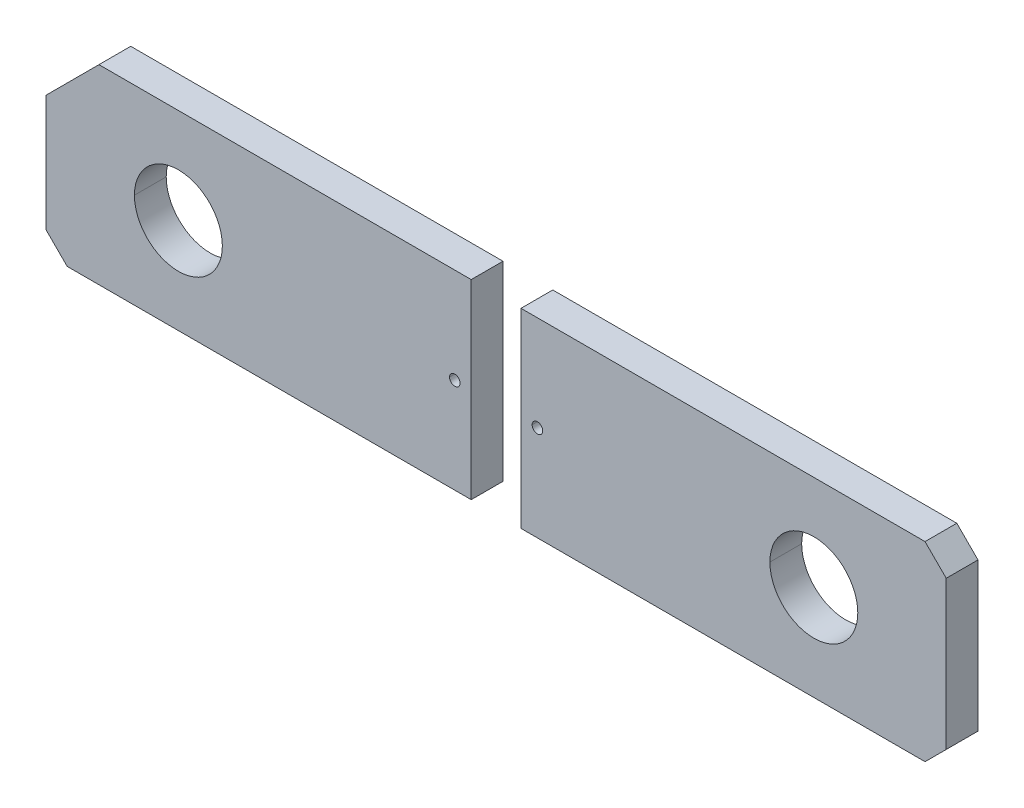
ISO-10303-21;
HEADER;
FILE_DESCRIPTION(('STEP AP214'),'2;1');
FILE_NAME('part.step','',(''),(''),'','','');
FILE_SCHEMA(('AUTOMOTIVE_DESIGN { 1 0 10303 214 1 1 1 1 }'));
ENDSEC;
DATA;
#1=APPLICATION_CONTEXT('core data for automotive mechanical design processes');
#2=APPLICATION_PROTOCOL_DEFINITION('international standard','automotive_design',2000,#1);
#3=PRODUCT_CONTEXT('',#1,'mechanical');
#4=PRODUCT('Part','Part','',(#3));
#5=PRODUCT_RELATED_PRODUCT_CATEGORY('part','',(#4));
#6=PRODUCT_DEFINITION_FORMATION('','',#4);
#7=PRODUCT_DEFINITION_CONTEXT('part definition',#1,'design');
#8=PRODUCT_DEFINITION('design','',#6,#7);
#9=PRODUCT_DEFINITION_SHAPE('','',#8);
#10=(LENGTH_UNIT() NAMED_UNIT(*) SI_UNIT(.MILLI.,.METRE.));
#11=(NAMED_UNIT(*) PLANE_ANGLE_UNIT() SI_UNIT($,.RADIAN.));
#12=(NAMED_UNIT(*) SI_UNIT($,.STERADIAN.) SOLID_ANGLE_UNIT());
#13=UNCERTAINTY_MEASURE_WITH_UNIT(LENGTH_MEASURE(1.E-05),#10,'distance_accuracy_value','');
#14=(GEOMETRIC_REPRESENTATION_CONTEXT(3) GLOBAL_UNCERTAINTY_ASSIGNED_CONTEXT((#13)) GLOBAL_UNIT_ASSIGNED_CONTEXT((#10,
#11,#12)) REPRESENTATION_CONTEXT('',''));
#15=CARTESIAN_POINT('',(0.,0.,0.));
#16=DIRECTION('',(0.,0.,1.));
#17=DIRECTION('',(1.,0.,0.));
#18=AXIS2_PLACEMENT_3D('',#15,#16,#17);
#19=CARTESIAN_POINT('',(-3.9,0.,3.));
#20=DIRECTION('',(0.,0.,1.));
#21=DIRECTION('',(1.,0.,0.));
#22=AXIS2_PLACEMENT_3D('',#19,#20,#21);
#23=CYLINDRICAL_SURFACE('',#22,0.5);
#24=DIRECTION('',(0.,0.,-1.));
#25=VECTOR('',#24,1.);
#26=CARTESIAN_POINT('',(-3.4,0.,3.));
#27=LINE('',#26,#25);
#28=CARTESIAN_POINT('',(-3.4,0.,3.));
#29=VERTEX_POINT('',#28);
#30=CARTESIAN_POINT('',(-3.4,0.,0.));
#31=VERTEX_POINT('',#30);
#32=EDGE_CURVE('P0_E232',#29,#31,#27,.T.);
#33=ORIENTED_EDGE('',*,*,#32,.F.);
#34=CARTESIAN_POINT('',(-3.9,0.,3.));
#35=DIRECTION('',(0.,0.,1.));
#36=DIRECTION('',(1.,0.,0.));
#37=AXIS2_PLACEMENT_3D('',#34,#35,#36);
#38=CIRCLE('',#37,0.5);
#39=CARTESIAN_POINT('',(-4.4,0.,3.));
#40=VERTEX_POINT('',#39);
#41=EDGE_CURVE('P0_E180',#29,#40,#38,.T.);
#42=ORIENTED_EDGE('',*,*,#41,.T.);
#43=DIRECTION('',(0.,0.,-1.));
#44=VECTOR('',#43,1.);
#45=CARTESIAN_POINT('',(-4.4,0.,3.));
#46=LINE('',#45,#44);
#47=CARTESIAN_POINT('',(-4.4,0.,0.));
#48=VERTEX_POINT('',#47);
#49=EDGE_CURVE('P0_E241',#40,#48,#46,.T.);
#50=ORIENTED_EDGE('',*,*,#49,.T.);
#51=CARTESIAN_POINT('',(-3.9,0.,0.));
#52=DIRECTION('',(0.,0.,1.));
#53=DIRECTION('',(1.,0.,0.));
#54=AXIS2_PLACEMENT_3D('',#51,#52,#53);
#55=CIRCLE('',#54,0.5);
#56=EDGE_CURVE('P0_E140',#31,#48,#55,.T.);
#57=ORIENTED_EDGE('',*,*,#56,.F.);
#58=EDGE_LOOP('',(#33,#42,#50,#57));
#59=FACE_BOUND('',#58,.T.);
#60=ADVANCED_FACE('P0_F17',(#59),#23,.F.);
#61=CARTESIAN_POINT('',(-42.5,9.,0.));
#62=DIRECTION('',(-1.,0.,0.));
#63=DIRECTION('',(0.,0.,1.));
#64=AXIS2_PLACEMENT_3D('',#61,#62,#63);
#65=PLANE('',#64);
#66=DIRECTION('',(0.,-1.,0.));
#67=VECTOR('',#66,1.);
#68=CARTESIAN_POINT('',(-42.5,4.,0.));
#69=LINE('',#68,#67);
#70=CARTESIAN_POINT('',(-42.5,4.,0.));
#71=VERTEX_POINT('',#70);
#72=CARTESIAN_POINT('',(-42.5,-7.,0.));
#73=VERTEX_POINT('',#72);
#74=EDGE_CURVE('P0_E155',#71,#73,#69,.T.);
#75=ORIENTED_EDGE('',*,*,#74,.T.);
#76=DIRECTION('',(0.,0.,-1.));
#77=VECTOR('',#76,1.);
#78=CARTESIAN_POINT('',(-42.5,-7.,3.));
#79=LINE('',#78,#77);
#80=CARTESIAN_POINT('',(-42.5,-7.,3.));
#81=VERTEX_POINT('',#80);
#82=EDGE_CURVE('P0_E11',#81,#73,#79,.T.);
#83=ORIENTED_EDGE('',*,*,#82,.F.);
#84=DIRECTION('',(0.,-1.,0.));
#85=VECTOR('',#84,1.);
#86=CARTESIAN_POINT('',(-42.5,4.,3.));
#87=LINE('',#86,#85);
#88=CARTESIAN_POINT('',(-42.5,4.,3.));
#89=VERTEX_POINT('',#88);
#90=EDGE_CURVE('P0_E127',#89,#81,#87,.T.);
#91=ORIENTED_EDGE('',*,*,#90,.F.);
#92=DIRECTION('',(0.,0.,-1.));
#93=VECTOR('',#92,1.);
#94=CARTESIAN_POINT('',(-42.5,4.,3.));
#95=LINE('',#94,#93);
#96=EDGE_CURVE('P0_E184',#89,#71,#95,.T.);
#97=ORIENTED_EDGE('',*,*,#96,.T.);
#98=EDGE_LOOP('',(#75,#83,#91,#97));
#99=FACE_BOUND('',#98,.T.);
#100=ADVANCED_FACE('P0_F222',(#99),#65,.T.);
#101=CARTESIAN_POINT('',(-41.5,-8.,1.5));
#102=DIRECTION('',(-0.707106781186548,-0.707106781186548,0.));
#103=DIRECTION('',(-0.707106781186548,0.707106781186548,0.));
#104=AXIS2_PLACEMENT_3D('',#101,#102,#103);
#105=PLANE('',#104);
#106=DIRECTION('',(0.,0.,-1.));
#107=VECTOR('',#106,1.);
#108=CARTESIAN_POINT('',(-40.5,-9.,3.));
#109=LINE('',#108,#107);
#110=CARTESIAN_POINT('',(-40.5,-9.,3.));
#111=VERTEX_POINT('',#110);
#112=CARTESIAN_POINT('',(-40.5,-9.,0.));
#113=VERTEX_POINT('',#112);
#114=EDGE_CURVE('P0_E20',#111,#113,#109,.T.);
#115=ORIENTED_EDGE('',*,*,#114,.F.);
#116=DIRECTION('',(0.707106781186548,-0.707106781186548,0.));
#117=VECTOR('',#116,1.);
#118=CARTESIAN_POINT('',(-42.5,-7.,3.));
#119=LINE('',#118,#117);
#120=EDGE_CURVE('P0_E164',#81,#111,#119,.T.);
#121=ORIENTED_EDGE('',*,*,#120,.F.);
#122=ORIENTED_EDGE('',*,*,#82,.T.);
#123=DIRECTION('',(-0.707106781186548,0.707106781186548,0.));
#124=VECTOR('',#123,1.);
#125=CARTESIAN_POINT('',(-40.5,-9.,0.));
#126=LINE('',#125,#124);
#127=EDGE_CURVE('P0_E203',#113,#73,#126,.T.);
#128=ORIENTED_EDGE('',*,*,#127,.F.);
#129=EDGE_LOOP('',(#115,#121,#122,#128));
#130=FACE_BOUND('',#129,.T.);
#131=ADVANCED_FACE('P0_F204',(#130),#105,.T.);
#132=CARTESIAN_POINT('',(-42.5,-9.,0.));
#133=DIRECTION('',(0.,-1.,0.));
#134=DIRECTION('',(0.,0.,-1.));
#135=AXIS2_PLACEMENT_3D('',#132,#133,#134);
#136=PLANE('',#135);
#137=DIRECTION('',(1.,0.,0.));
#138=VECTOR('',#137,1.);
#139=CARTESIAN_POINT('',(-40.5,-9.,0.));
#140=LINE('',#139,#138);
#141=CARTESIAN_POINT('',(-2.35,-9.,0.));
#142=VERTEX_POINT('',#141);
#143=EDGE_CURVE('P0_E200',#113,#142,#140,.T.);
#144=ORIENTED_EDGE('',*,*,#143,.T.);
#145=DIRECTION('',(0.,0.,1.));
#146=VECTOR('',#145,1.);
#147=CARTESIAN_POINT('',(-2.35,-9.,0.));
#148=LINE('',#147,#146);
#149=CARTESIAN_POINT('',(-2.35,-9.,3.));
#150=VERTEX_POINT('',#149);
#151=EDGE_CURVE('P0_E190',#142,#150,#148,.T.);
#152=ORIENTED_EDGE('',*,*,#151,.T.);
#153=DIRECTION('',(1.,0.,0.));
#154=VECTOR('',#153,1.);
#155=CARTESIAN_POINT('',(-40.5,-9.,3.));
#156=LINE('',#155,#154);
#157=EDGE_CURVE('P0_E168',#111,#150,#156,.T.);
#158=ORIENTED_EDGE('',*,*,#157,.F.);
#159=ORIENTED_EDGE('',*,*,#114,.T.);
#160=EDGE_LOOP('',(#144,#152,#158,#159));
#161=FACE_BOUND('',#160,.T.);
#162=ADVANCED_FACE('P0_F198',(#161),#136,.T.);
#163=CARTESIAN_POINT('',(-2.35,9.,3.));
#164=DIRECTION('',(-1.,0.,0.));
#165=DIRECTION('',(0.,0.,1.));
#166=AXIS2_PLACEMENT_3D('',#163,#164,#165);
#167=PLANE('',#166);
#168=DIRECTION('',(0.,0.,1.));
#169=VECTOR('',#168,1.);
#170=CARTESIAN_POINT('',(-2.35,9.,0.));
#171=LINE('',#170,#169);
#172=CARTESIAN_POINT('',(-2.35,9.,0.));
#173=VERTEX_POINT('',#172);
#174=CARTESIAN_POINT('',(-2.35,9.,3.));
#175=VERTEX_POINT('',#174);
#176=EDGE_CURVE('P0_E51',#173,#175,#171,.T.);
#177=ORIENTED_EDGE('',*,*,#176,.T.);
#178=DIRECTION('',(0.,1.,0.));
#179=VECTOR('',#178,1.);
#180=CARTESIAN_POINT('',(-2.35,-9.,3.));
#181=LINE('',#180,#179);
#182=EDGE_CURVE('P0_E172',#150,#175,#181,.T.);
#183=ORIENTED_EDGE('',*,*,#182,.F.);
#184=ORIENTED_EDGE('',*,*,#151,.F.);
#185=DIRECTION('',(0.,1.,0.));
#186=VECTOR('',#185,1.);
#187=CARTESIAN_POINT('',(-2.35,-9.,0.));
#188=LINE('',#187,#186);
#189=EDGE_CURVE('P0_E211',#142,#173,#188,.T.);
#190=ORIENTED_EDGE('',*,*,#189,.T.);
#191=EDGE_LOOP('',(#177,#183,#184,#190));
#192=FACE_BOUND('',#191,.T.);
#193=ADVANCED_FACE('P0_F291',(#192),#167,.F.);
#194=CARTESIAN_POINT('',(42.5,9.,0.));
#195=DIRECTION('',(0.,1.,0.));
#196=DIRECTION('',(1.,0.,0.));
#197=AXIS2_PLACEMENT_3D('',#194,#195,#196);
#198=PLANE('',#197);
#199=DIRECTION('',(-1.,0.,0.));
#200=VECTOR('',#199,1.);
#201=CARTESIAN_POINT('',(-2.35,9.,3.));
#202=LINE('',#201,#200);
#203=CARTESIAN_POINT('',(-37.5,9.,3.));
#204=VERTEX_POINT('',#203);
#205=EDGE_CURVE('P0_E150',#175,#204,#202,.T.);
#206=ORIENTED_EDGE('',*,*,#205,.F.);
#207=ORIENTED_EDGE('',*,*,#176,.F.);
#208=DIRECTION('',(-1.,0.,0.));
#209=VECTOR('',#208,1.);
#210=CARTESIAN_POINT('',(-2.35,9.,0.));
#211=LINE('',#210,#209);
#212=CARTESIAN_POINT('',(-37.5,9.,0.));
#213=VERTEX_POINT('',#212);
#214=EDGE_CURVE('P0_E218',#173,#213,#211,.T.);
#215=ORIENTED_EDGE('',*,*,#214,.T.);
#216=DIRECTION('',(0.,0.,-1.));
#217=VECTOR('',#216,1.);
#218=CARTESIAN_POINT('',(-37.5,9.,3.));
#219=LINE('',#218,#217);
#220=EDGE_CURVE('P0_E38',#204,#213,#219,.T.);
#221=ORIENTED_EDGE('',*,*,#220,.F.);
#222=EDGE_LOOP('',(#206,#207,#215,#221));
#223=FACE_BOUND('',#222,.T.);
#224=ADVANCED_FACE('P0_F225',(#223),#198,.T.);
#225=CARTESIAN_POINT('',(-40.,6.5,1.5));
#226=DIRECTION('',(-0.707106781186548,0.707106781186548,0.));
#227=DIRECTION('',(0.,0.,1.));
#228=AXIS2_PLACEMENT_3D('',#225,#226,#227);
#229=PLANE('',#228);
#230=ORIENTED_EDGE('',*,*,#96,.F.);
#231=DIRECTION('',(-0.707106781186548,-0.707106781186548,0.));
#232=VECTOR('',#231,1.);
#233=CARTESIAN_POINT('',(-37.5,9.,3.));
#234=LINE('',#233,#232);
#235=EDGE_CURVE('P0_E176',#204,#89,#234,.T.);
#236=ORIENTED_EDGE('',*,*,#235,.F.);
#237=ORIENTED_EDGE('',*,*,#220,.T.);
#238=DIRECTION('',(0.707106781186548,0.707106781186548,0.));
#239=VECTOR('',#238,1.);
#240=CARTESIAN_POINT('',(-42.5,4.,0.));
#241=LINE('',#240,#239);
#242=EDGE_CURVE('P0_E152',#71,#213,#241,.T.);
#243=ORIENTED_EDGE('',*,*,#242,.F.);
#244=EDGE_LOOP('',(#230,#236,#237,#243));
#245=FACE_BOUND('',#244,.T.);
#246=ADVANCED_FACE('P0_F272',(#245),#229,.T.);
#247=CARTESIAN_POINT('',(0.,0.,3.));
#248=DIRECTION('',(0.,0.,1.));
#249=DIRECTION('',(1.,0.,0.));
#250=AXIS2_PLACEMENT_3D('',#247,#248,#249);
#251=PLANE('',#250);
#252=CARTESIAN_POINT('',(-3.9,0.,3.));
#253=DIRECTION('',(0.,0.,1.));
#254=DIRECTION('',(-1.,0.,0.));
#255=AXIS2_PLACEMENT_3D('',#252,#253,#254);
#256=CIRCLE('',#255,0.5);
#257=EDGE_CURVE('P0_E238',#40,#29,#256,.T.);
#258=ORIENTED_EDGE('',*,*,#257,.F.);
#259=ORIENTED_EDGE('',*,*,#41,.F.);
#260=EDGE_LOOP('',(#258,#259));
#261=FACE_BOUND('',#260,.T.);
#262=CARTESIAN_POINT('',(-30.,0.,3.));
#263=DIRECTION('',(0.,0.,1.));
#264=DIRECTION('',(-1.,0.,0.));
#265=AXIS2_PLACEMENT_3D('',#262,#263,#264);
#266=CIRCLE('',#265,4.15);
#267=CARTESIAN_POINT('',(-34.15,0.,3.));
#268=VERTEX_POINT('',#267);
#269=CARTESIAN_POINT('',(-25.85,0.,3.));
#270=VERTEX_POINT('',#269);
#271=EDGE_CURVE('P0_E116',#268,#270,#266,.T.);
#272=ORIENTED_EDGE('',*,*,#271,.F.);
#273=CARTESIAN_POINT('',(-30.,0.,3.));
#274=DIRECTION('',(0.,0.,1.));
#275=DIRECTION('',(1.,0.,0.));
#276=AXIS2_PLACEMENT_3D('',#273,#274,#275);
#277=CIRCLE('',#276,4.15);
#278=EDGE_CURVE('P0_E129',#270,#268,#277,.T.);
#279=ORIENTED_EDGE('',*,*,#278,.F.);
#280=EDGE_LOOP('',(#272,#279));
#281=FACE_BOUND('',#280,.T.);
#282=ORIENTED_EDGE('',*,*,#90,.T.);
#283=ORIENTED_EDGE('',*,*,#120,.T.);
#284=ORIENTED_EDGE('',*,*,#157,.T.);
#285=ORIENTED_EDGE('',*,*,#182,.T.);
#286=ORIENTED_EDGE('',*,*,#205,.T.);
#287=ORIENTED_EDGE('',*,*,#235,.T.);
#288=EDGE_LOOP('',(#282,#283,#284,#285,#286,#287));
#289=FACE_BOUND('',#288,.T.);
#290=ADVANCED_FACE('P0_F130',(#261,#281,#289),#251,.T.);
#291=CARTESIAN_POINT('',(-30.,0.,3.));
#292=DIRECTION('',(0.,0.,1.));
#293=DIRECTION('',(1.,0.,0.));
#294=AXIS2_PLACEMENT_3D('',#291,#292,#293);
#295=CYLINDRICAL_SURFACE('',#294,4.15);
#296=DIRECTION('',(0.,0.,-1.));
#297=VECTOR('',#296,1.);
#298=CARTESIAN_POINT('',(-34.15,0.,3.));
#299=LINE('',#298,#297);
#300=CARTESIAN_POINT('',(-34.15,0.,0.));
#301=VERTEX_POINT('',#300);
#302=EDGE_CURVE('P0_E123',#268,#301,#299,.T.);
#303=ORIENTED_EDGE('',*,*,#302,.F.);
#304=ORIENTED_EDGE('',*,*,#271,.T.);
#305=DIRECTION('',(0.,0.,-1.));
#306=VECTOR('',#305,1.);
#307=CARTESIAN_POINT('',(-25.85,0.,3.));
#308=LINE('',#307,#306);
#309=CARTESIAN_POINT('',(-25.85,0.,0.));
#310=VERTEX_POINT('',#309);
#311=EDGE_CURVE('P0_E121',#270,#310,#308,.T.);
#312=ORIENTED_EDGE('',*,*,#311,.T.);
#313=CARTESIAN_POINT('',(-30.,0.,0.));
#314=DIRECTION('',(0.,0.,1.));
#315=DIRECTION('',(-1.,0.,0.));
#316=AXIS2_PLACEMENT_3D('',#313,#314,#315);
#317=CIRCLE('',#316,4.15);
#318=EDGE_CURVE('P0_E154',#301,#310,#317,.T.);
#319=ORIENTED_EDGE('',*,*,#318,.F.);
#320=EDGE_LOOP('',(#303,#304,#312,#319));
#321=FACE_BOUND('',#320,.T.);
#322=ADVANCED_FACE('P0_F118',(#321),#295,.F.);
#323=CARTESIAN_POINT('',(-30.,0.,3.));
#324=DIRECTION('',(0.,0.,1.));
#325=DIRECTION('',(1.,0.,0.));
#326=AXIS2_PLACEMENT_3D('',#323,#324,#325);
#327=CYLINDRICAL_SURFACE('',#326,4.15);
#328=ORIENTED_EDGE('',*,*,#311,.F.);
#329=ORIENTED_EDGE('',*,*,#278,.T.);
#330=ORIENTED_EDGE('',*,*,#302,.T.);
#331=CARTESIAN_POINT('',(-30.,0.,0.));
#332=DIRECTION('',(0.,0.,1.));
#333=DIRECTION('',(1.,0.,0.));
#334=AXIS2_PLACEMENT_3D('',#331,#332,#333);
#335=CIRCLE('',#334,4.15);
#336=EDGE_CURVE('P0_E137',#310,#301,#335,.T.);
#337=ORIENTED_EDGE('',*,*,#336,.F.);
#338=EDGE_LOOP('',(#328,#329,#330,#337));
#339=FACE_BOUND('',#338,.T.);
#340=ADVANCED_FACE('P0_F135',(#339),#327,.F.);
#341=CARTESIAN_POINT('',(0.,0.,0.));
#342=DIRECTION('',(0.,0.,1.));
#343=DIRECTION('',(1.,0.,0.));
#344=AXIS2_PLACEMENT_3D('',#341,#342,#343);
#345=PLANE('',#344);
#346=CARTESIAN_POINT('',(-3.9,0.,0.));
#347=DIRECTION('',(0.,0.,1.));
#348=DIRECTION('',(-1.,0.,0.));
#349=AXIS2_PLACEMENT_3D('',#346,#347,#348);
#350=CIRCLE('',#349,0.5);
#351=EDGE_CURVE('P0_E227',#48,#31,#350,.T.);
#352=ORIENTED_EDGE('',*,*,#351,.T.);
#353=ORIENTED_EDGE('',*,*,#56,.T.);
#354=EDGE_LOOP('',(#352,#353));
#355=FACE_BOUND('',#354,.T.);
#356=ORIENTED_EDGE('',*,*,#318,.T.);
#357=ORIENTED_EDGE('',*,*,#336,.T.);
#358=EDGE_LOOP('',(#356,#357));
#359=FACE_BOUND('',#358,.T.);
#360=ORIENTED_EDGE('',*,*,#214,.F.);
#361=ORIENTED_EDGE('',*,*,#189,.F.);
#362=ORIENTED_EDGE('',*,*,#143,.F.);
#363=ORIENTED_EDGE('',*,*,#127,.T.);
#364=ORIENTED_EDGE('',*,*,#74,.F.);
#365=ORIENTED_EDGE('',*,*,#242,.T.);
#366=EDGE_LOOP('',(#360,#361,#362,#363,#364,#365));
#367=FACE_BOUND('',#366,.T.);
#368=ADVANCED_FACE('P0_F210',(#355,#359,#367),#345,.F.);
#369=CARTESIAN_POINT('',(-3.9,0.,3.));
#370=DIRECTION('',(0.,0.,1.));
#371=DIRECTION('',(1.,0.,0.));
#372=AXIS2_PLACEMENT_3D('',#369,#370,#371);
#373=CYLINDRICAL_SURFACE('',#372,0.5);
#374=ORIENTED_EDGE('',*,*,#49,.F.);
#375=ORIENTED_EDGE('',*,*,#257,.T.);
#376=ORIENTED_EDGE('',*,*,#32,.T.);
#377=ORIENTED_EDGE('',*,*,#351,.F.);
#378=EDGE_LOOP('',(#374,#375,#376,#377));
#379=FACE_BOUND('',#378,.T.);
#380=ADVANCED_FACE('P0_F259',(#379),#373,.F.);
#381=CLOSED_SHELL('',(#60,#100,#131,#162,#193,#224,#246,#290,#322,#340,#368,#380));
#382=MANIFOLD_SOLID_BREP('P0_B1',#381);
#383=CARTESIAN_POINT('',(3.9,0.,3.));
#384=DIRECTION('',(0.,0.,1.));
#385=DIRECTION('',(1.,0.,0.));
#386=AXIS2_PLACEMENT_3D('',#383,#384,#385);
#387=CYLINDRICAL_SURFACE('',#386,0.5);
#388=DIRECTION('',(0.,0.,-1.));
#389=VECTOR('',#388,1.);
#390=CARTESIAN_POINT('',(4.4,0.,3.));
#391=LINE('',#390,#389);
#392=CARTESIAN_POINT('',(4.4,0.,3.));
#393=VERTEX_POINT('',#392);
#394=CARTESIAN_POINT('',(4.4,0.,0.));
#395=VERTEX_POINT('',#394);
#396=EDGE_CURVE('P1_E123',#393,#395,#391,.T.);
#397=ORIENTED_EDGE('',*,*,#396,.F.);
#398=CARTESIAN_POINT('',(3.9,0.,3.));
#399=DIRECTION('',(0.,0.,1.));
#400=DIRECTION('',(1.,0.,0.));
#401=AXIS2_PLACEMENT_3D('',#398,#399,#400);
#402=CIRCLE('',#401,0.5);
#403=CARTESIAN_POINT('',(3.4,0.,3.));
#404=VERTEX_POINT('',#403);
#405=EDGE_CURVE('P1_E118',#393,#404,#402,.T.);
#406=ORIENTED_EDGE('',*,*,#405,.T.);
#407=DIRECTION('',(0.,0.,-1.));
#408=VECTOR('',#407,1.);
#409=CARTESIAN_POINT('',(3.4,0.,3.));
#410=LINE('',#409,#408);
#411=CARTESIAN_POINT('',(3.4,0.,0.));
#412=VERTEX_POINT('',#411);
#413=EDGE_CURVE('P1_E121',#404,#412,#410,.T.);
#414=ORIENTED_EDGE('',*,*,#413,.T.);
#415=CARTESIAN_POINT('',(3.9,0.,0.));
#416=DIRECTION('',(0.,0.,1.));
#417=DIRECTION('',(1.,0.,0.));
#418=AXIS2_PLACEMENT_3D('',#415,#416,#417);
#419=CIRCLE('',#418,0.5);
#420=EDGE_CURVE('P1_E162',#395,#412,#419,.T.);
#421=ORIENTED_EDGE('',*,*,#420,.F.);
#422=EDGE_LOOP('',(#397,#406,#414,#421));
#423=FACE_BOUND('',#422,.T.);
#424=ADVANCED_FACE('P1_F16',(#423),#387,.F.);
#425=CARTESIAN_POINT('',(30.,0.,3.));
#426=DIRECTION('',(0.,0.,1.));
#427=DIRECTION('',(1.,0.,0.));
#428=AXIS2_PLACEMENT_3D('',#425,#426,#427);
#429=CYLINDRICAL_SURFACE('',#428,4.15);
#430=DIRECTION('',(0.,0.,-1.));
#431=VECTOR('',#430,1.);
#432=CARTESIAN_POINT('',(25.85,0.,3.));
#433=LINE('',#432,#431);
#434=CARTESIAN_POINT('',(25.85,0.,3.));
#435=VERTEX_POINT('',#434);
#436=CARTESIAN_POINT('',(25.85,0.,0.));
#437=VERTEX_POINT('',#436);
#438=EDGE_CURVE('P1_E10',#435,#437,#433,.T.);
#439=ORIENTED_EDGE('',*,*,#438,.F.);
#440=CARTESIAN_POINT('',(30.,0.,3.));
#441=DIRECTION('',(0.,0.,1.));
#442=DIRECTION('',(-1.,0.,0.));
#443=AXIS2_PLACEMENT_3D('',#440,#441,#442);
#444=CIRCLE('',#443,4.15);
#445=CARTESIAN_POINT('',(34.15,0.,3.));
#446=VERTEX_POINT('',#445);
#447=EDGE_CURVE('P1_E221',#435,#446,#444,.T.);
#448=ORIENTED_EDGE('',*,*,#447,.T.);
#449=DIRECTION('',(0.,0.,-1.));
#450=VECTOR('',#449,1.);
#451=CARTESIAN_POINT('',(34.15,0.,3.));
#452=LINE('',#451,#450);
#453=CARTESIAN_POINT('',(34.15,0.,0.));
#454=VERTEX_POINT('',#453);
#455=EDGE_CURVE('P1_E25',#446,#454,#452,.T.);
#456=ORIENTED_EDGE('',*,*,#455,.T.);
#457=CARTESIAN_POINT('',(30.,0.,0.));
#458=DIRECTION('',(0.,0.,1.));
#459=DIRECTION('',(-1.,0.,0.));
#460=AXIS2_PLACEMENT_3D('',#457,#458,#459);
#461=CIRCLE('',#460,4.15);
#462=EDGE_CURVE('P1_E151',#437,#454,#461,.T.);
#463=ORIENTED_EDGE('',*,*,#462,.F.);
#464=EDGE_LOOP('',(#439,#448,#456,#463));
#465=FACE_BOUND('',#464,.T.);
#466=ADVANCED_FACE('P1_F18',(#465),#429,.F.);
#467=CARTESIAN_POINT('',(30.,0.,3.));
#468=DIRECTION('',(0.,0.,1.));
#469=DIRECTION('',(1.,0.,0.));
#470=AXIS2_PLACEMENT_3D('',#467,#468,#469);
#471=CYLINDRICAL_SURFACE('',#470,4.15);
#472=ORIENTED_EDGE('',*,*,#455,.F.);
#473=CARTESIAN_POINT('',(30.,0.,3.));
#474=DIRECTION('',(0.,0.,1.));
#475=DIRECTION('',(1.,0.,0.));
#476=AXIS2_PLACEMENT_3D('',#473,#474,#475);
#477=CIRCLE('',#476,4.15);
#478=EDGE_CURVE('P1_E127',#446,#435,#477,.T.);
#479=ORIENTED_EDGE('',*,*,#478,.T.);
#480=ORIENTED_EDGE('',*,*,#438,.T.);
#481=CARTESIAN_POINT('',(30.,0.,0.));
#482=DIRECTION('',(0.,0.,1.));
#483=DIRECTION('',(1.,0.,0.));
#484=AXIS2_PLACEMENT_3D('',#481,#482,#483);
#485=CIRCLE('',#484,4.15);
#486=EDGE_CURVE('P1_E155',#454,#437,#485,.T.);
#487=ORIENTED_EDGE('',*,*,#486,.F.);
#488=EDGE_LOOP('',(#472,#479,#480,#487));
#489=FACE_BOUND('',#488,.T.);
#490=ADVANCED_FACE('P1_F228',(#489),#471,.F.);
#491=CARTESIAN_POINT('',(0.,0.,3.));
#492=DIRECTION('',(0.,0.,1.));
#493=DIRECTION('',(1.,0.,0.));
#494=AXIS2_PLACEMENT_3D('',#491,#492,#493);
#495=PLANE('',#494);
#496=CARTESIAN_POINT('',(3.9,0.,3.));
#497=DIRECTION('',(0.,0.,1.));
#498=DIRECTION('',(-1.,0.,0.));
#499=AXIS2_PLACEMENT_3D('',#496,#497,#498);
#500=CIRCLE('',#499,0.5);
#501=EDGE_CURVE('P1_E129',#404,#393,#500,.T.);
#502=ORIENTED_EDGE('',*,*,#501,.F.);
#503=ORIENTED_EDGE('',*,*,#405,.F.);
#504=EDGE_LOOP('',(#502,#503));
#505=FACE_BOUND('',#504,.T.);
#506=ORIENTED_EDGE('',*,*,#447,.F.);
#507=ORIENTED_EDGE('',*,*,#478,.F.);
#508=EDGE_LOOP('',(#506,#507));
#509=FACE_BOUND('',#508,.T.);
#510=DIRECTION('',(-1.,0.,0.));
#511=VECTOR('',#510,1.);
#512=CARTESIAN_POINT('',(40.5,9.,3.));
#513=LINE('',#512,#511);
#514=CARTESIAN_POINT('',(40.5,9.,3.));
#515=VERTEX_POINT('',#514);
#516=CARTESIAN_POINT('',(2.35,9.,3.));
#517=VERTEX_POINT('',#516);
#518=EDGE_CURVE('P1_E218',#515,#517,#513,.T.);
#519=ORIENTED_EDGE('',*,*,#518,.T.);
#520=DIRECTION('',(0.,1.,0.));
#521=VECTOR('',#520,1.);
#522=CARTESIAN_POINT('',(2.35,-9.,3.));
#523=LINE('',#522,#521);
#524=CARTESIAN_POINT('',(2.35,-9.,3.));
#525=VERTEX_POINT('',#524);
#526=EDGE_CURVE('P1_E210',#525,#517,#523,.T.);
#527=ORIENTED_EDGE('',*,*,#526,.F.);
#528=DIRECTION('',(1.,0.,0.));
#529=VECTOR('',#528,1.);
#530=CARTESIAN_POINT('',(2.35,-9.,3.));
#531=LINE('',#530,#529);
#532=CARTESIAN_POINT('',(40.5,-9.,3.));
#533=VERTEX_POINT('',#532);
#534=EDGE_CURVE('P1_E203',#525,#533,#531,.T.);
#535=ORIENTED_EDGE('',*,*,#534,.T.);
#536=DIRECTION('',(0.707106781186548,0.707106781186548,0.));
#537=VECTOR('',#536,1.);
#538=CARTESIAN_POINT('',(40.5,-9.,3.));
#539=LINE('',#538,#537);
#540=CARTESIAN_POINT('',(42.5,-7.,3.));
#541=VERTEX_POINT('',#540);
#542=EDGE_CURVE('P1_E197',#533,#541,#539,.T.);
#543=ORIENTED_EDGE('',*,*,#542,.T.);
#544=DIRECTION('',(0.,1.,0.));
#545=VECTOR('',#544,1.);
#546=CARTESIAN_POINT('',(42.5,-7.,3.));
#547=LINE('',#546,#545);
#548=CARTESIAN_POINT('',(42.5,7.,3.));
#549=VERTEX_POINT('',#548);
#550=EDGE_CURVE('P1_E191',#541,#549,#547,.T.);
#551=ORIENTED_EDGE('',*,*,#550,.T.);
#552=DIRECTION('',(-0.707106781186548,0.707106781186548,0.));
#553=VECTOR('',#552,1.);
#554=CARTESIAN_POINT('',(42.5,7.,3.));
#555=LINE('',#554,#553);
#556=EDGE_CURVE('P1_E146',#549,#515,#555,.T.);
#557=ORIENTED_EDGE('',*,*,#556,.T.);
#558=EDGE_LOOP('',(#519,#527,#535,#543,#551,#557));
#559=FACE_BOUND('',#558,.T.);
#560=ADVANCED_FACE('P1_F130',(#505,#509,#559),#495,.T.);
#561=CARTESIAN_POINT('',(42.5,9.,0.));
#562=DIRECTION('',(0.,1.,0.));
#563=DIRECTION('',(1.,0.,0.));
#564=AXIS2_PLACEMENT_3D('',#561,#562,#563);
#565=PLANE('',#564);
#566=DIRECTION('',(-1.,0.,0.));
#567=VECTOR('',#566,1.);
#568=CARTESIAN_POINT('',(40.5,9.,0.));
#569=LINE('',#568,#567);
#570=CARTESIAN_POINT('',(40.5,9.,0.));
#571=VERTEX_POINT('',#570);
#572=CARTESIAN_POINT('',(2.35,9.,0.));
#573=VERTEX_POINT('',#572);
#574=EDGE_CURVE('P1_E181',#571,#573,#569,.T.);
#575=ORIENTED_EDGE('',*,*,#574,.T.);
#576=DIRECTION('',(0.,0.,1.));
#577=VECTOR('',#576,1.);
#578=CARTESIAN_POINT('',(2.35,9.,0.));
#579=LINE('',#578,#577);
#580=EDGE_CURVE('P1_E214',#573,#517,#579,.T.);
#581=ORIENTED_EDGE('',*,*,#580,.T.);
#582=ORIENTED_EDGE('',*,*,#518,.F.);
#583=DIRECTION('',(0.,0.,-1.));
#584=VECTOR('',#583,1.);
#585=CARTESIAN_POINT('',(40.5,9.,3.));
#586=LINE('',#585,#584);
#587=EDGE_CURVE('P1_E159',#515,#571,#586,.T.);
#588=ORIENTED_EDGE('',*,*,#587,.T.);
#589=EDGE_LOOP('',(#575,#581,#582,#588));
#590=FACE_BOUND('',#589,.T.);
#591=ADVANCED_FACE('P1_F258',(#590),#565,.T.);
#592=CARTESIAN_POINT('',(2.35,-9.,3.));
#593=DIRECTION('',(1.,0.,0.));
#594=DIRECTION('',(0.,1.,0.));
#595=AXIS2_PLACEMENT_3D('',#592,#593,#594);
#596=PLANE('',#595);
#597=DIRECTION('',(0.,0.,1.));
#598=VECTOR('',#597,1.);
#599=CARTESIAN_POINT('',(2.35,-9.,0.));
#600=LINE('',#599,#598);
#601=CARTESIAN_POINT('',(2.35,-9.,0.));
#602=VERTEX_POINT('',#601);
#603=EDGE_CURVE('P1_E206',#602,#525,#600,.T.);
#604=ORIENTED_EDGE('',*,*,#603,.T.);
#605=ORIENTED_EDGE('',*,*,#526,.T.);
#606=ORIENTED_EDGE('',*,*,#580,.F.);
#607=DIRECTION('',(0.,1.,0.));
#608=VECTOR('',#607,1.);
#609=CARTESIAN_POINT('',(2.35,-9.,0.));
#610=LINE('',#609,#608);
#611=EDGE_CURVE('P1_E177',#602,#573,#610,.T.);
#612=ORIENTED_EDGE('',*,*,#611,.F.);
#613=EDGE_LOOP('',(#604,#605,#606,#612));
#614=FACE_BOUND('',#613,.T.);
#615=ADVANCED_FACE('P1_F256',(#614),#596,.F.);
#616=CARTESIAN_POINT('',(-42.5,-9.,0.));
#617=DIRECTION('',(0.,-1.,0.));
#618=DIRECTION('',(0.,0.,-1.));
#619=AXIS2_PLACEMENT_3D('',#616,#617,#618);
#620=PLANE('',#619);
#621=ORIENTED_EDGE('',*,*,#534,.F.);
#622=ORIENTED_EDGE('',*,*,#603,.F.);
#623=DIRECTION('',(1.,0.,0.));
#624=VECTOR('',#623,1.);
#625=CARTESIAN_POINT('',(2.35,-9.,0.));
#626=LINE('',#625,#624);
#627=CARTESIAN_POINT('',(40.5,-9.,0.));
#628=VERTEX_POINT('',#627);
#629=EDGE_CURVE('P1_E173',#602,#628,#626,.T.);
#630=ORIENTED_EDGE('',*,*,#629,.T.);
#631=DIRECTION('',(0.,0.,-1.));
#632=VECTOR('',#631,1.);
#633=CARTESIAN_POINT('',(40.5,-9.,3.));
#634=LINE('',#633,#632);
#635=EDGE_CURVE('P1_E200',#533,#628,#634,.T.);
#636=ORIENTED_EDGE('',*,*,#635,.F.);
#637=EDGE_LOOP('',(#621,#622,#630,#636));
#638=FACE_BOUND('',#637,.T.);
#639=ADVANCED_FACE('P1_F253',(#638),#620,.T.);
#640=CARTESIAN_POINT('',(41.5,-8.,1.5));
#641=DIRECTION('',(0.707106781186548,-0.707106781186548,0.));
#642=DIRECTION('',(0.,0.,-1.));
#643=AXIS2_PLACEMENT_3D('',#640,#641,#642);
#644=PLANE('',#643);
#645=DIRECTION('',(0.,0.,-1.));
#646=VECTOR('',#645,1.);
#647=CARTESIAN_POINT('',(42.5,-7.,3.));
#648=LINE('',#647,#646);
#649=CARTESIAN_POINT('',(42.5,-7.,0.));
#650=VERTEX_POINT('',#649);
#651=EDGE_CURVE('P1_E194',#541,#650,#648,.T.);
#652=ORIENTED_EDGE('',*,*,#651,.F.);
#653=ORIENTED_EDGE('',*,*,#542,.F.);
#654=ORIENTED_EDGE('',*,*,#635,.T.);
#655=DIRECTION('',(-0.707106781186548,-0.707106781186548,0.));
#656=VECTOR('',#655,1.);
#657=CARTESIAN_POINT('',(42.5,-7.,0.));
#658=LINE('',#657,#656);
#659=EDGE_CURVE('P1_E149',#650,#628,#658,.T.);
#660=ORIENTED_EDGE('',*,*,#659,.F.);
#661=EDGE_LOOP('',(#652,#653,#654,#660));
#662=FACE_BOUND('',#661,.T.);
#663=ADVANCED_FACE('P1_F249',(#662),#644,.T.);
#664=CARTESIAN_POINT('',(42.5,-9.,0.));
#665=DIRECTION('',(1.,0.,0.));
#666=DIRECTION('',(0.,1.,0.));
#667=AXIS2_PLACEMENT_3D('',#664,#665,#666);
#668=PLANE('',#667);
#669=ORIENTED_EDGE('',*,*,#550,.F.);
#670=ORIENTED_EDGE('',*,*,#651,.T.);
#671=DIRECTION('',(0.,1.,0.));
#672=VECTOR('',#671,1.);
#673=CARTESIAN_POINT('',(42.5,-7.,0.));
#674=LINE('',#673,#672);
#675=CARTESIAN_POINT('',(42.5,7.,0.));
#676=VERTEX_POINT('',#675);
#677=EDGE_CURVE('P1_E147',#650,#676,#674,.T.);
#678=ORIENTED_EDGE('',*,*,#677,.T.);
#679=DIRECTION('',(0.,0.,-1.));
#680=VECTOR('',#679,1.);
#681=CARTESIAN_POINT('',(42.5,7.,3.));
#682=LINE('',#681,#680);
#683=EDGE_CURVE('P1_E188',#549,#676,#682,.T.);
#684=ORIENTED_EDGE('',*,*,#683,.F.);
#685=EDGE_LOOP('',(#669,#670,#678,#684));
#686=FACE_BOUND('',#685,.T.);
#687=ADVANCED_FACE('P1_F244',(#686),#668,.T.);
#688=CARTESIAN_POINT('',(41.5,8.,1.5));
#689=DIRECTION('',(0.707106781186548,0.707106781186548,0.));
#690=DIRECTION('',(0.,0.,-1.));
#691=AXIS2_PLACEMENT_3D('',#688,#689,#690);
#692=PLANE('',#691);
#693=ORIENTED_EDGE('',*,*,#587,.F.);
#694=ORIENTED_EDGE('',*,*,#556,.F.);
#695=ORIENTED_EDGE('',*,*,#683,.T.);
#696=DIRECTION('',(0.707106781186548,-0.707106781186548,0.));
#697=VECTOR('',#696,1.);
#698=CARTESIAN_POINT('',(40.5,9.,0.));
#699=LINE('',#698,#697);
#700=EDGE_CURVE('P1_E156',#571,#676,#699,.T.);
#701=ORIENTED_EDGE('',*,*,#700,.F.);
#702=EDGE_LOOP('',(#693,#694,#695,#701));
#703=FACE_BOUND('',#702,.T.);
#704=ADVANCED_FACE('P1_F233',(#703),#692,.T.);
#705=CARTESIAN_POINT('',(0.,0.,0.));
#706=DIRECTION('',(0.,0.,1.));
#707=DIRECTION('',(1.,0.,0.));
#708=AXIS2_PLACEMENT_3D('',#705,#706,#707);
#709=PLANE('',#708);
#710=CARTESIAN_POINT('',(3.9,0.,0.));
#711=DIRECTION('',(0.,0.,1.));
#712=DIRECTION('',(-1.,0.,0.));
#713=AXIS2_PLACEMENT_3D('',#710,#711,#712);
#714=CIRCLE('',#713,0.5);
#715=EDGE_CURVE('P1_E138',#412,#395,#714,.T.);
#716=ORIENTED_EDGE('',*,*,#715,.T.);
#717=ORIENTED_EDGE('',*,*,#420,.T.);
#718=EDGE_LOOP('',(#716,#717));
#719=FACE_BOUND('',#718,.T.);
#720=ORIENTED_EDGE('',*,*,#462,.T.);
#721=ORIENTED_EDGE('',*,*,#486,.T.);
#722=EDGE_LOOP('',(#720,#721));
#723=FACE_BOUND('',#722,.T.);
#724=ORIENTED_EDGE('',*,*,#677,.F.);
#725=ORIENTED_EDGE('',*,*,#659,.T.);
#726=ORIENTED_EDGE('',*,*,#629,.F.);
#727=ORIENTED_EDGE('',*,*,#611,.T.);
#728=ORIENTED_EDGE('',*,*,#574,.F.);
#729=ORIENTED_EDGE('',*,*,#700,.T.);
#730=EDGE_LOOP('',(#724,#725,#726,#727,#728,#729));
#731=FACE_BOUND('',#730,.T.);
#732=ADVANCED_FACE('P1_F230',(#719,#723,#731),#709,.F.);
#733=CARTESIAN_POINT('',(3.9,0.,3.));
#734=DIRECTION('',(0.,0.,1.));
#735=DIRECTION('',(1.,0.,0.));
#736=AXIS2_PLACEMENT_3D('',#733,#734,#735);
#737=CYLINDRICAL_SURFACE('',#736,0.5);
#738=ORIENTED_EDGE('',*,*,#413,.F.);
#739=ORIENTED_EDGE('',*,*,#501,.T.);
#740=ORIENTED_EDGE('',*,*,#396,.T.);
#741=ORIENTED_EDGE('',*,*,#715,.F.);
#742=EDGE_LOOP('',(#738,#739,#740,#741));
#743=FACE_BOUND('',#742,.T.);
#744=ADVANCED_FACE('P1_F136',(#743),#737,.F.);
#745=CLOSED_SHELL('',(#424,#466,#490,#560,#591,#615,#639,#663,#687,#704,#732,#744));
#746=MANIFOLD_SOLID_BREP('P1_B1',#745);
#747=ADVANCED_BREP_SHAPE_REPRESENTATION('',(#18,#382,#746),#14);
#748=SHAPE_DEFINITION_REPRESENTATION(#9,#747);
ENDSEC;
END-ISO-10303-21;
